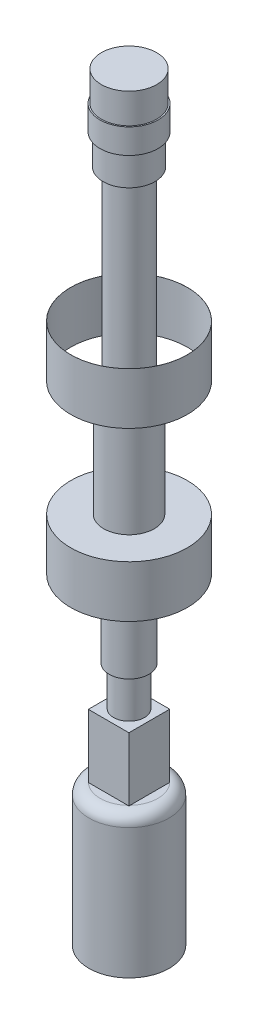
ISO-10303-21;
HEADER;
FILE_DESCRIPTION(('STEP AP214'),'2;1');
FILE_NAME('part.step','',(''),(''),'','','');
FILE_SCHEMA(('AUTOMOTIVE_DESIGN { 1 0 10303 214 1 1 1 1 }'));
ENDSEC;
DATA;
#1=APPLICATION_CONTEXT('core data for automotive mechanical design processes');
#2=APPLICATION_PROTOCOL_DEFINITION('international standard','automotive_design',2000,#1);
#3=PRODUCT_CONTEXT('',#1,'mechanical');
#4=PRODUCT('Part','Part','',(#3));
#5=PRODUCT_RELATED_PRODUCT_CATEGORY('part','',(#4));
#6=PRODUCT_DEFINITION_FORMATION('','',#4);
#7=PRODUCT_DEFINITION_CONTEXT('part definition',#1,'design');
#8=PRODUCT_DEFINITION('design','',#6,#7);
#9=PRODUCT_DEFINITION_SHAPE('','',#8);
#10=(LENGTH_UNIT() NAMED_UNIT(*) SI_UNIT(.MILLI.,.METRE.));
#11=(NAMED_UNIT(*) PLANE_ANGLE_UNIT() SI_UNIT($,.RADIAN.));
#12=(NAMED_UNIT(*) SI_UNIT($,.STERADIAN.) SOLID_ANGLE_UNIT());
#13=UNCERTAINTY_MEASURE_WITH_UNIT(LENGTH_MEASURE(1.E-05),#10,'distance_accuracy_value','');
#14=(GEOMETRIC_REPRESENTATION_CONTEXT(3) GLOBAL_UNCERTAINTY_ASSIGNED_CONTEXT((#13)) GLOBAL_UNIT_ASSIGNED_CONTEXT((#10,
#11,#12)) REPRESENTATION_CONTEXT('',''));
#15=CARTESIAN_POINT('',(0.,0.,0.));
#16=DIRECTION('',(0.,0.,1.));
#17=DIRECTION('',(1.,0.,0.));
#18=AXIS2_PLACEMENT_3D('',#15,#16,#17);
#19=CARTESIAN_POINT('',(36.9158813836408,487.4,-31.0812191882091));
#20=DIRECTION('',(0.,1.,0.));
#21=DIRECTION('',(0.,0.,1.));
#22=AXIS2_PLACEMENT_3D('',#19,#20,#21);
#23=PLANE('',#22);
#24=CARTESIAN_POINT('',(36.9158813836408,487.4,-31.0812191882091));
#25=DIRECTION('',(0.,1.,0.));
#26=DIRECTION('',(0.,0.,1.));
#27=AXIS2_PLACEMENT_3D('',#24,#25,#26);
#28=CIRCLE('',#27,51.55);
#29=CARTESIAN_POINT('',(36.9158813836408,487.4,-82.6312191882091));
#30=VERTEX_POINT('',#29);
#31=EDGE_CURVE('E11',#30,#30,#28,.T.);
#32=ORIENTED_EDGE('',*,*,#31,.T.);
#33=EDGE_LOOP('',(#32));
#34=FACE_BOUND('',#33,.T.);
#35=CARTESIAN_POINT('',(36.9158813836408,487.4,-31.0812191882091));
#36=DIRECTION('',(0.,1.,0.));
#37=DIRECTION('',(0.,0.,1.));
#38=AXIS2_PLACEMENT_3D('',#35,#36,#37);
#39=CIRCLE('',#38,51.51);
#40=CARTESIAN_POINT('',(36.9158813836408,487.4,-82.5912191882091));
#41=VERTEX_POINT('',#40);
#42=EDGE_CURVE('E56',#41,#41,#39,.T.);
#43=ORIENTED_EDGE('',*,*,#42,.F.);
#44=EDGE_LOOP('',(#43));
#45=FACE_BOUND('',#44,.T.);
#46=ADVANCED_FACE('F45',(#34,#45),#23,.T.);
#47=CARTESIAN_POINT('',(36.9158813836408,441.7,-31.0812191882091));
#48=DIRECTION('',(0.,1.,0.));
#49=DIRECTION('',(0.,0.,1.));
#50=AXIS2_PLACEMENT_3D('',#47,#48,#49);
#51=PLANE('',#50);
#52=CARTESIAN_POINT('',(36.9158813836408,441.7,-31.0812191882091));
#53=DIRECTION('',(0.,1.,0.));
#54=DIRECTION('',(0.,0.,1.));
#55=AXIS2_PLACEMENT_3D('',#52,#53,#54);
#56=CIRCLE('',#55,51.55);
#57=CARTESIAN_POINT('',(36.9158813836408,441.7,-82.6312191882091));
#58=VERTEX_POINT('',#57);
#59=EDGE_CURVE('E49',#58,#58,#56,.T.);
#60=ORIENTED_EDGE('',*,*,#59,.F.);
#61=EDGE_LOOP('',(#60));
#62=FACE_BOUND('',#61,.T.);
#63=CARTESIAN_POINT('',(36.9158813836408,441.7,-31.0812191882091));
#64=DIRECTION('',(0.,1.,0.));
#65=DIRECTION('',(0.,0.,1.));
#66=AXIS2_PLACEMENT_3D('',#63,#64,#65);
#67=CIRCLE('',#66,51.51);
#68=CARTESIAN_POINT('',(36.9158813836408,441.7,-82.5912191882091));
#69=VERTEX_POINT('',#68);
#70=EDGE_CURVE('E58',#69,#69,#67,.T.);
#71=ORIENTED_EDGE('',*,*,#70,.T.);
#72=EDGE_LOOP('',(#71));
#73=FACE_BOUND('',#72,.T.);
#74=ADVANCED_FACE('F68',(#62,#73),#51,.F.);
#75=CARTESIAN_POINT('',(36.9158813836408,487.4,-31.0812191882091));
#76=DIRECTION('',(0.,-1.,0.));
#77=DIRECTION('',(0.,0.,-1.));
#78=AXIS2_PLACEMENT_3D('',#75,#76,#77);
#79=CYLINDRICAL_SURFACE('',#78,51.55);
#80=CARTESIAN_POINT('',(36.9158813836408,487.4,-82.6312191882091));
#81=CARTESIAN_POINT('',(36.9158813836408,486.923958333333,-82.6312191882091));
#82=CARTESIAN_POINT('',(36.9158813836408,486.447916666667,-82.6312191882091));
#83=CARTESIAN_POINT('',(36.9158813836408,485.495833333333,-82.6312191882091));
#84=CARTESIAN_POINT('',(36.9158813836408,485.019791666667,-82.6312191882091));
#85=CARTESIAN_POINT('',(36.9158813836408,484.067708333333,-82.6312191882091));
#86=CARTESIAN_POINT('',(36.9158813836408,483.591666666667,-82.6312191882091));
#87=CARTESIAN_POINT('',(36.9158813836408,482.639583333333,-82.6312191882091));
#88=CARTESIAN_POINT('',(36.9158813836408,482.163541666667,-82.6312191882091));
#89=CARTESIAN_POINT('',(36.9158813836408,481.211458333333,-82.6312191882091));
#90=CARTESIAN_POINT('',(36.9158813836408,480.735416666667,-82.6312191882091));
#91=CARTESIAN_POINT('',(36.9158813836408,479.783333333333,-82.6312191882091));
#92=CARTESIAN_POINT('',(36.9158813836408,479.307291666667,-82.6312191882091));
#93=CARTESIAN_POINT('',(36.9158813836408,478.355208333333,-82.6312191882091));
#94=CARTESIAN_POINT('',(36.9158813836408,477.879166666667,-82.6312191882091));
#95=CARTESIAN_POINT('',(36.9158813836408,476.927083333333,-82.6312191882091));
#96=CARTESIAN_POINT('',(36.9158813836408,476.451041666667,-82.6312191882091));
#97=CARTESIAN_POINT('',(36.9158813836408,475.498958333333,-82.6312191882091));
#98=CARTESIAN_POINT('',(36.9158813836408,475.022916666667,-82.6312191882091));
#99=CARTESIAN_POINT('',(36.9158813836408,474.070833333333,-82.6312191882091));
#100=CARTESIAN_POINT('',(36.9158813836408,473.594791666667,-82.6312191882091));
#101=CARTESIAN_POINT('',(36.9158813836408,472.642708333333,-82.6312191882091));
#102=CARTESIAN_POINT('',(36.9158813836408,472.166666666667,-82.6312191882091));
#103=CARTESIAN_POINT('',(36.9158813836408,471.214583333333,-82.6312191882091));
#104=CARTESIAN_POINT('',(36.9158813836408,470.738541666667,-82.6312191882091));
#105=CARTESIAN_POINT('',(36.9158813836408,469.786458333333,-82.6312191882091));
#106=CARTESIAN_POINT('',(36.9158813836408,469.310416666667,-82.6312191882091));
#107=CARTESIAN_POINT('',(36.9158813836408,468.358333333333,-82.6312191882091));
#108=CARTESIAN_POINT('',(36.9158813836408,467.882291666667,-82.6312191882091));
#109=CARTESIAN_POINT('',(36.9158813836408,466.930208333333,-82.6312191882091));
#110=CARTESIAN_POINT('',(36.9158813836408,466.454166666667,-82.6312191882091));
#111=CARTESIAN_POINT('',(36.9158813836408,465.502083333333,-82.6312191882091));
#112=CARTESIAN_POINT('',(36.9158813836408,465.026041666667,-82.6312191882091));
#113=CARTESIAN_POINT('',(36.9158813836408,464.073958333333,-82.6312191882091));
#114=CARTESIAN_POINT('',(36.9158813836408,463.597916666667,-82.6312191882091));
#115=CARTESIAN_POINT('',(36.9158813836408,462.645833333333,-82.6312191882091));
#116=CARTESIAN_POINT('',(36.9158813836408,462.169791666667,-82.6312191882091));
#117=CARTESIAN_POINT('',(36.9158813836408,461.217708333333,-82.6312191882091));
#118=CARTESIAN_POINT('',(36.9158813836408,460.741666666667,-82.6312191882091));
#119=CARTESIAN_POINT('',(36.9158813836408,459.789583333333,-82.6312191882091));
#120=CARTESIAN_POINT('',(36.9158813836408,459.313541666667,-82.6312191882091));
#121=CARTESIAN_POINT('',(36.9158813836408,458.361458333333,-82.6312191882091));
#122=CARTESIAN_POINT('',(36.9158813836408,457.885416666667,-82.6312191882091));
#123=CARTESIAN_POINT('',(36.9158813836408,456.933333333333,-82.6312191882091));
#124=CARTESIAN_POINT('',(36.9158813836408,456.457291666667,-82.6312191882091));
#125=CARTESIAN_POINT('',(36.9158813836408,455.505208333333,-82.6312191882091));
#126=CARTESIAN_POINT('',(36.9158813836408,455.029166666667,-82.6312191882091));
#127=CARTESIAN_POINT('',(36.9158813836408,454.077083333333,-82.6312191882091));
#128=CARTESIAN_POINT('',(36.9158813836408,453.601041666667,-82.6312191882091));
#129=CARTESIAN_POINT('',(36.9158813836408,452.648958333333,-82.6312191882091));
#130=CARTESIAN_POINT('',(36.9158813836408,452.172916666667,-82.6312191882091));
#131=CARTESIAN_POINT('',(36.9158813836408,451.220833333333,-82.6312191882091));
#132=CARTESIAN_POINT('',(36.9158813836408,450.744791666667,-82.6312191882091));
#133=CARTESIAN_POINT('',(36.9158813836408,449.792708333333,-82.6312191882091));
#134=CARTESIAN_POINT('',(36.9158813836408,449.316666666667,-82.6312191882091));
#135=CARTESIAN_POINT('',(36.9158813836408,448.364583333333,-82.6312191882091));
#136=CARTESIAN_POINT('',(36.9158813836408,447.888541666667,-82.6312191882091));
#137=CARTESIAN_POINT('',(36.9158813836408,446.936458333333,-82.6312191882091));
#138=CARTESIAN_POINT('',(36.9158813836408,446.460416666667,-82.6312191882091));
#139=CARTESIAN_POINT('',(36.9158813836408,445.508333333333,-82.6312191882091));
#140=CARTESIAN_POINT('',(36.9158813836408,445.032291666667,-82.6312191882091));
#141=CARTESIAN_POINT('',(36.9158813836408,444.080208333333,-82.6312191882091));
#142=CARTESIAN_POINT('',(36.9158813836408,443.604166666667,-82.6312191882091));
#143=CARTESIAN_POINT('',(36.9158813836408,442.652083333333,-82.6312191882091));
#144=CARTESIAN_POINT('',(36.9158813836408,442.176041666667,-82.6312191882091));
#145=CARTESIAN_POINT('',(36.9158813836408,441.7,-82.6312191882091));
#146=B_SPLINE_CURVE_WITH_KNOTS('',3,(#80,#81,#82,#83,#84,#85,#86,#87,#88,#89,#90,#91,#92,#93,
#94,#95,#96,#97,#98,#99,#100,#101,#102,#103,#104,#105,#106,#107,#108,#109,#110,#111,#112,#113,
#114,#115,#116,#117,#118,#119,#120,#121,#122,#123,#124,#125,#126,#127,#128,#129,#130,#131,#132,
#133,#134,#135,#136,#137,#138,#139,#140,#141,#142,#143,#144,#145),.UNSPECIFIED.,.F.,.F.,(4,2,2,
2,2,2,2,2,2,2,2,2,2,2,2,2,2,2,2,2,2,2,2,2,2,2,2,2,2,2,2,2,4),(0.,1.42812499999995,
2.85624999999995,4.28437499999995,5.71249999999995,7.14062499999996,8.56874999999996,
9.99687499999996,11.425,12.853125,14.28125,15.709375,17.1375,18.565625,19.99375,21.421875,22.85,
24.278125,25.70625,27.134375,28.5625,29.990625,31.41875,32.846875,34.275,35.703125,37.13125,
38.559375,39.9875,41.415625,42.84375,44.271875,45.7),.UNSPECIFIED.);
#147=EDGE_CURVE('BSEAM47',#30,#58,#146,.T.);
#148=ORIENTED_EDGE('',*,*,#31,.F.);
#149=ORIENTED_EDGE('',*,*,#59,.T.);
#150=ORIENTED_EDGE('',*,*,#147,.T.);
#151=ORIENTED_EDGE('',*,*,#147,.F.);
#152=EDGE_LOOP('',(#148,#150,#149,#151));
#153=FACE_BOUND('',#152,.T.);
#154=ADVANCED_FACE('F47',(#153),#79,.T.);
#155=CARTESIAN_POINT('',(36.9158813836408,487.4,-31.0812191882091));
#156=DIRECTION('',(0.,-1.,0.));
#157=DIRECTION('',(0.,0.,-1.));
#158=AXIS2_PLACEMENT_3D('',#155,#156,#157);
#159=CYLINDRICAL_SURFACE('',#158,51.51);
#160=CARTESIAN_POINT('',(36.9158813836408,487.4,-82.5912191882091));
#161=CARTESIAN_POINT('',(36.9158813836408,486.923958333333,-82.5912191882091));
#162=CARTESIAN_POINT('',(36.9158813836408,486.447916666667,-82.5912191882091));
#163=CARTESIAN_POINT('',(36.9158813836408,485.495833333333,-82.5912191882091));
#164=CARTESIAN_POINT('',(36.9158813836408,485.019791666667,-82.5912191882091));
#165=CARTESIAN_POINT('',(36.9158813836408,484.067708333333,-82.5912191882091));
#166=CARTESIAN_POINT('',(36.9158813836408,483.591666666667,-82.5912191882091));
#167=CARTESIAN_POINT('',(36.9158813836408,482.639583333333,-82.5912191882091));
#168=CARTESIAN_POINT('',(36.9158813836408,482.163541666667,-82.5912191882091));
#169=CARTESIAN_POINT('',(36.9158813836408,481.211458333333,-82.5912191882091));
#170=CARTESIAN_POINT('',(36.9158813836408,480.735416666667,-82.5912191882091));
#171=CARTESIAN_POINT('',(36.9158813836408,479.783333333333,-82.5912191882091));
#172=CARTESIAN_POINT('',(36.9158813836408,479.307291666667,-82.5912191882091));
#173=CARTESIAN_POINT('',(36.9158813836408,478.355208333333,-82.5912191882091));
#174=CARTESIAN_POINT('',(36.9158813836408,477.879166666667,-82.5912191882091));
#175=CARTESIAN_POINT('',(36.9158813836408,476.927083333333,-82.5912191882091));
#176=CARTESIAN_POINT('',(36.9158813836408,476.451041666667,-82.5912191882091));
#177=CARTESIAN_POINT('',(36.9158813836408,475.498958333333,-82.5912191882091));
#178=CARTESIAN_POINT('',(36.9158813836408,475.022916666667,-82.5912191882091));
#179=CARTESIAN_POINT('',(36.9158813836408,474.070833333333,-82.5912191882091));
#180=CARTESIAN_POINT('',(36.9158813836408,473.594791666667,-82.5912191882091));
#181=CARTESIAN_POINT('',(36.9158813836408,472.642708333333,-82.5912191882091));
#182=CARTESIAN_POINT('',(36.9158813836408,472.166666666667,-82.5912191882091));
#183=CARTESIAN_POINT('',(36.9158813836408,471.214583333333,-82.5912191882091));
#184=CARTESIAN_POINT('',(36.9158813836408,470.738541666667,-82.5912191882091));
#185=CARTESIAN_POINT('',(36.9158813836408,469.786458333333,-82.5912191882091));
#186=CARTESIAN_POINT('',(36.9158813836408,469.310416666667,-82.5912191882091));
#187=CARTESIAN_POINT('',(36.9158813836408,468.358333333333,-82.5912191882091));
#188=CARTESIAN_POINT('',(36.9158813836408,467.882291666667,-82.5912191882091));
#189=CARTESIAN_POINT('',(36.9158813836408,466.930208333333,-82.5912191882091));
#190=CARTESIAN_POINT('',(36.9158813836408,466.454166666667,-82.5912191882091));
#191=CARTESIAN_POINT('',(36.9158813836408,465.502083333333,-82.5912191882091));
#192=CARTESIAN_POINT('',(36.9158813836408,465.026041666667,-82.5912191882091));
#193=CARTESIAN_POINT('',(36.9158813836408,464.073958333333,-82.5912191882091));
#194=CARTESIAN_POINT('',(36.9158813836408,463.597916666667,-82.5912191882091));
#195=CARTESIAN_POINT('',(36.9158813836408,462.645833333333,-82.5912191882091));
#196=CARTESIAN_POINT('',(36.9158813836408,462.169791666667,-82.5912191882091));
#197=CARTESIAN_POINT('',(36.9158813836408,461.217708333333,-82.5912191882091));
#198=CARTESIAN_POINT('',(36.9158813836408,460.741666666667,-82.5912191882091));
#199=CARTESIAN_POINT('',(36.9158813836408,459.789583333333,-82.5912191882091));
#200=CARTESIAN_POINT('',(36.9158813836408,459.313541666667,-82.5912191882091));
#201=CARTESIAN_POINT('',(36.9158813836408,458.361458333333,-82.5912191882091));
#202=CARTESIAN_POINT('',(36.9158813836408,457.885416666667,-82.5912191882091));
#203=CARTESIAN_POINT('',(36.9158813836408,456.933333333333,-82.5912191882091));
#204=CARTESIAN_POINT('',(36.9158813836408,456.457291666667,-82.5912191882091));
#205=CARTESIAN_POINT('',(36.9158813836408,455.505208333333,-82.5912191882091));
#206=CARTESIAN_POINT('',(36.9158813836408,455.029166666667,-82.5912191882091));
#207=CARTESIAN_POINT('',(36.9158813836408,454.077083333333,-82.5912191882091));
#208=CARTESIAN_POINT('',(36.9158813836408,453.601041666667,-82.5912191882091));
#209=CARTESIAN_POINT('',(36.9158813836408,452.648958333333,-82.5912191882091));
#210=CARTESIAN_POINT('',(36.9158813836408,452.172916666667,-82.5912191882091));
#211=CARTESIAN_POINT('',(36.9158813836408,451.220833333333,-82.5912191882091));
#212=CARTESIAN_POINT('',(36.9158813836408,450.744791666667,-82.5912191882091));
#213=CARTESIAN_POINT('',(36.9158813836408,449.792708333333,-82.5912191882091));
#214=CARTESIAN_POINT('',(36.9158813836408,449.316666666667,-82.5912191882091));
#215=CARTESIAN_POINT('',(36.9158813836408,448.364583333333,-82.5912191882091));
#216=CARTESIAN_POINT('',(36.9158813836408,447.888541666667,-82.5912191882091));
#217=CARTESIAN_POINT('',(36.9158813836408,446.936458333333,-82.5912191882091));
#218=CARTESIAN_POINT('',(36.9158813836408,446.460416666667,-82.5912191882091));
#219=CARTESIAN_POINT('',(36.9158813836408,445.508333333333,-82.5912191882091));
#220=CARTESIAN_POINT('',(36.9158813836408,445.032291666667,-82.5912191882091));
#221=CARTESIAN_POINT('',(36.9158813836408,444.080208333333,-82.5912191882091));
#222=CARTESIAN_POINT('',(36.9158813836408,443.604166666667,-82.5912191882091));
#223=CARTESIAN_POINT('',(36.9158813836408,442.652083333333,-82.5912191882091));
#224=CARTESIAN_POINT('',(36.9158813836408,442.176041666667,-82.5912191882091));
#225=CARTESIAN_POINT('',(36.9158813836408,441.7,-82.5912191882091));
#226=B_SPLINE_CURVE_WITH_KNOTS('',3,(#160,#161,#162,#163,#164,#165,#166,#167,#168,#169,#170,
#171,#172,#173,#174,#175,#176,#177,#178,#179,#180,#181,#182,#183,#184,#185,#186,#187,#188,#189,
#190,#191,#192,#193,#194,#195,#196,#197,#198,#199,#200,#201,#202,#203,#204,#205,#206,#207,#208,
#209,#210,#211,#212,#213,#214,#215,#216,#217,#218,#219,#220,#221,#222,#223,#224,#225),
.UNSPECIFIED.,.F.,.F.,(4,2,2,2,2,2,2,2,2,2,2,2,2,2,2,2,2,2,2,2,2,2,2,2,2,2,2,2,2,2,2,2,4),(0.,
1.428125,2.85625,4.28437500000001,5.71250000000001,7.14062500000001,8.56875000000001,
9.99687500000002,11.425,12.853125,14.28125,15.709375,17.1375,18.565625,19.99375,21.421875,22.85,
24.278125,25.70625,27.134375,28.5625,29.990625,31.4187500000001,32.8468750000001,
34.2750000000001,35.7031250000001,37.1312500000001,38.5593750000001,39.9875000000001,
41.4156250000001,42.84375,44.271875,45.7),.UNSPECIFIED.);
#227=EDGE_CURVE('BSEAM64',#41,#69,#226,.T.);
#228=ORIENTED_EDGE('',*,*,#42,.T.);
#229=ORIENTED_EDGE('',*,*,#70,.F.);
#230=ORIENTED_EDGE('',*,*,#227,.T.);
#231=ORIENTED_EDGE('',*,*,#227,.F.);
#232=EDGE_LOOP('',(#228,#230,#229,#231));
#233=FACE_BOUND('',#232,.T.);
#234=ADVANCED_FACE('F64',(#233),#159,.F.);
#235=CLOSED_SHELL('',(#46,#74,#154,#234));
#236=MANIFOLD_SOLID_BREP('B2',#235);
#237=CARTESIAN_POINT('',(36.9158813836408,135.,-31.0812191882091));
#238=DIRECTION('',(0.,1.,0.));
#239=DIRECTION('',(0.,0.,1.));
#240=AXIS2_PLACEMENT_3D('',#237,#238,#239);
#241=PLANE('',#240);
#242=CARTESIAN_POINT('',(36.9158813836408,135.,-31.0812191882091));
#243=DIRECTION('',(0.,1.,0.));
#244=DIRECTION('',(0.,0.,1.));
#245=AXIS2_PLACEMENT_3D('',#242,#243,#244);
#246=CIRCLE('',#245,25.4211124709785);
#247=CARTESIAN_POINT('',(19.4888926142153,135.,-12.5735715339971));
#248=VERTEX_POINT('',#247);
#249=CARTESIAN_POINT('',(54.3428701530662,135.,-12.5735715339971));
#250=VERTEX_POINT('',#249);
#251=EDGE_CURVE('E189',#248,#250,#246,.T.);
#252=ORIENTED_EDGE('',*,*,#251,.T.);
#253=DIRECTION('',(1.,0.,0.));
#254=VECTOR('',#253,1.);
#255=CARTESIAN_POINT('',(19.4888926142153,135.,-12.5735715339971));
#256=LINE('',#255,#254);
#257=EDGE_CURVE('E129',#248,#250,#256,.T.);
#258=ORIENTED_EDGE('',*,*,#257,.F.);
#259=EDGE_LOOP('',(#252,#258));
#260=FACE_BOUND('',#259,.T.);
#261=ADVANCED_FACE('F107',(#260),#241,.T.);
#262=CARTESIAN_POINT('',(55.3117195204943,135.,-48.626192784793));
#263=VERTEX_POINT('',#262);
#264=EDGE_CURVE('E232',#263,#248,#246,.T.);
#265=ORIENTED_EDGE('',*,*,#264,.T.);
#266=DIRECTION('',(0.,0.,1.));
#267=VECTOR('',#266,1.);
#268=CARTESIAN_POINT('',(19.4888926142153,135.,-12.5735715339971));
#269=LINE('',#268,#267);
#270=CARTESIAN_POINT('',(19.4888926142153,135.,-48.626192784793));
#271=VERTEX_POINT('',#270);
#272=EDGE_CURVE('E122',#271,#248,#269,.T.);
#273=ORIENTED_EDGE('',*,*,#272,.F.);
#274=DIRECTION('',(-1.,0.,0.));
#275=VECTOR('',#274,1.);
#276=CARTESIAN_POINT('',(19.4888926142153,135.,-48.626192784793));
#277=LINE('',#276,#275);
#278=EDGE_CURVE('E174',#263,#271,#277,.T.);
#279=ORIENTED_EDGE('',*,*,#278,.F.);
#280=EDGE_LOOP('',(#265,#273,#279));
#281=FACE_BOUND('',#280,.T.);
#282=ADVANCED_FACE('F234',(#281),#241,.T.);
#283=CARTESIAN_POINT('',(55.3117195204943,135.,-13.5362455916253));
#284=VERTEX_POINT('',#283);
#285=EDGE_CURVE('E194',#284,#263,#246,.T.);
#286=ORIENTED_EDGE('',*,*,#285,.T.);
#287=DIRECTION('',(0.,0.,-1.));
#288=VECTOR('',#287,1.);
#289=CARTESIAN_POINT('',(55.3117195204943,135.,-12.5735715339971));
#290=LINE('',#289,#288);
#291=EDGE_CURVE('E216',#284,#263,#290,.T.);
#292=ORIENTED_EDGE('',*,*,#291,.F.);
#293=EDGE_LOOP('',(#286,#292));
#294=FACE_BOUND('',#293,.T.);
#295=ADVANCED_FACE('F231',(#294),#241,.T.);
#296=CARTESIAN_POINT('',(36.9158813836408,10.,-31.0812191882091));
#297=DIRECTION('',(0.,-1.,0.));
#298=DIRECTION('',(0.,0.,-1.));
#299=AXIS2_PLACEMENT_3D('',#296,#297,#298);
#300=CYLINDRICAL_SURFACE('',#299,17.732160556241);
#301=CARTESIAN_POINT('',(36.9158813836408,10.,-31.0812191882091));
#302=DIRECTION('',(0.,1.,0.));
#303=DIRECTION('',(0.,0.,1.));
#304=AXIS2_PLACEMENT_3D('',#301,#302,#303);
#305=CIRCLE('',#304,17.732160556241);
#306=CARTESIAN_POINT('',(36.9158813836408,10.,-13.3490586319682));
#307=VERTEX_POINT('',#306);
#308=EDGE_CURVE('E186',#307,#307,#305,.T.);
#309=ORIENTED_EDGE('',*,*,#308,.F.);
#310=EDGE_LOOP('',(#309));
#311=FACE_BOUND('',#310,.T.);
#312=CARTESIAN_POINT('',(36.9158813836408,0.,-31.0812191882091));
#313=DIRECTION('',(0.,1.,0.));
#314=DIRECTION('',(0.,0.,1.));
#315=AXIS2_PLACEMENT_3D('',#312,#313,#314);
#316=CIRCLE('',#315,17.732160556241);
#317=CARTESIAN_POINT('',(36.9158813836408,0.,-13.3490586319682));
#318=VERTEX_POINT('',#317);
#319=EDGE_CURVE('E180',#318,#318,#316,.T.);
#320=ORIENTED_EDGE('',*,*,#319,.T.);
#321=EDGE_LOOP('',(#320));
#322=FACE_BOUND('',#321,.T.);
#323=ADVANCED_FACE('F242',(#311,#322),#300,.T.);
#324=CARTESIAN_POINT('',(36.9158813836408,0.,-31.0812191882091));
#325=DIRECTION('',(0.,1.,0.));
#326=DIRECTION('',(0.,0.,1.));
#327=AXIS2_PLACEMENT_3D('',#324,#325,#326);
#328=PLANE('',#327);
#329=ORIENTED_EDGE('',*,*,#319,.F.);
#330=EDGE_LOOP('',(#329));
#331=FACE_BOUND('',#330,.T.);
#332=ADVANCED_FACE('F246',(#331),#328,.F.);
#333=CARTESIAN_POINT('',(36.9158813836408,105.,-31.0812191882091));
#334=DIRECTION('',(0.,-1.,0.));
#335=DIRECTION('',(0.,0.,-1.));
#336=AXIS2_PLACEMENT_3D('',#333,#334,#335);
#337=CYLINDRICAL_SURFACE('',#336,35.4211124709785);
#338=CARTESIAN_POINT('',(36.9158813836408,125.,-31.0812191882091));
#339=DIRECTION('',(0.,1.,0.));
#340=DIRECTION('',(0.,0.,1.));
#341=AXIS2_PLACEMENT_3D('',#338,#339,#340);
#342=CIRCLE('',#341,35.4211124709785);
#343=CARTESIAN_POINT('',(36.9158813836408,125.,4.33989328276939));
#344=VERTEX_POINT('',#343);
#345=EDGE_CURVE('E115',#344,#344,#342,.F.);
#346=ORIENTED_EDGE('',*,*,#345,.T.);
#347=EDGE_LOOP('',(#346));
#348=FACE_BOUND('',#347,.T.);
#349=CARTESIAN_POINT('',(36.9158813836408,10.,-31.0812191882091));
#350=DIRECTION('',(0.,1.,0.));
#351=DIRECTION('',(0.,0.,1.));
#352=AXIS2_PLACEMENT_3D('',#349,#350,#351);
#353=CIRCLE('',#352,35.4211124709785);
#354=CARTESIAN_POINT('',(36.9158813836408,10.,4.33989328276939));
#355=VERTEX_POINT('',#354);
#356=EDGE_CURVE('E177',#355,#355,#353,.T.);
#357=ORIENTED_EDGE('',*,*,#356,.T.);
#358=EDGE_LOOP('',(#357));
#359=FACE_BOUND('',#358,.T.);
#360=ADVANCED_FACE('F198',(#348,#359),#337,.T.);
#361=CARTESIAN_POINT('',(36.9158813836408,10.,-31.0812191882091));
#362=DIRECTION('',(0.,1.,0.));
#363=DIRECTION('',(0.,0.,1.));
#364=AXIS2_PLACEMENT_3D('',#361,#362,#363);
#365=PLANE('',#364);
#366=ORIENTED_EDGE('',*,*,#308,.T.);
#367=EDGE_LOOP('',(#366));
#368=FACE_BOUND('',#367,.T.);
#369=ORIENTED_EDGE('',*,*,#356,.F.);
#370=EDGE_LOOP('',(#369));
#371=FACE_BOUND('',#370,.T.);
#372=ADVANCED_FACE('F203',(#368,#371),#365,.F.);
#373=CARTESIAN_POINT('',(36.9158813836408,125.,-31.0812191882091));
#374=DIRECTION('',(0.,1.,0.));
#375=DIRECTION('',(0.,0.,1.));
#376=AXIS2_PLACEMENT_3D('',#373,#374,#375);
#377=TOROIDAL_SURFACE('',#376,25.4211124709785,10.);
#378=ORIENTED_EDGE('',*,*,#345,.F.);
#379=EDGE_LOOP('',(#378));
#380=FACE_BOUND('',#379,.T.);
#381=EDGE_CURVE('E192',#250,#284,#246,.T.);
#382=ORIENTED_EDGE('',*,*,#381,.F.);
#383=ORIENTED_EDGE('',*,*,#251,.F.);
#384=ORIENTED_EDGE('',*,*,#264,.F.);
#385=ORIENTED_EDGE('',*,*,#285,.F.);
#386=EDGE_LOOP('',(#382,#383,#384,#385));
#387=FACE_BOUND('',#386,.T.);
#388=ADVANCED_FACE('F109',(#380,#387),#377,.T.);
#389=CARTESIAN_POINT('',(19.4888926142153,191.,-12.5735715339971));
#390=DIRECTION('',(1.,0.,0.));
#391=DIRECTION('',(0.,0.,-1.));
#392=AXIS2_PLACEMENT_3D('',#389,#390,#391);
#393=PLANE('',#392);
#394=ORIENTED_EDGE('',*,*,#272,.T.);
#395=DIRECTION('',(0.,-1.,0.));
#396=VECTOR('',#395,1.);
#397=CARTESIAN_POINT('',(19.4888926142153,191.,-12.5735715339971));
#398=LINE('',#397,#396);
#399=CARTESIAN_POINT('',(19.4888926142153,191.,-12.5735715339971));
#400=VERTEX_POINT('',#399);
#401=EDGE_CURVE('E159',#400,#248,#398,.T.);
#402=ORIENTED_EDGE('',*,*,#401,.F.);
#403=DIRECTION('',(0.,0.,1.));
#404=VECTOR('',#403,1.);
#405=CARTESIAN_POINT('',(19.4888926142153,191.,-12.5735715339971));
#406=LINE('',#405,#404);
#407=CARTESIAN_POINT('',(19.4888926142153,191.,-48.626192784793));
#408=VERTEX_POINT('',#407);
#409=EDGE_CURVE('E165',#408,#400,#406,.T.);
#410=ORIENTED_EDGE('',*,*,#409,.F.);
#411=DIRECTION('',(0.,-1.,0.));
#412=VECTOR('',#411,1.);
#413=CARTESIAN_POINT('',(19.4888926142153,191.,-48.626192784793));
#414=LINE('',#413,#412);
#415=EDGE_CURVE('E223',#408,#271,#414,.T.);
#416=ORIENTED_EDGE('',*,*,#415,.T.);
#417=EDGE_LOOP('',(#394,#402,#410,#416));
#418=FACE_BOUND('',#417,.T.);
#419=ADVANCED_FACE('F176',(#418),#393,.F.);
#420=CARTESIAN_POINT('',(19.4888926142153,191.,-12.5735715339971));
#421=DIRECTION('',(0.,0.,-1.));
#422=DIRECTION('',(-1.,0.,0.));
#423=AXIS2_PLACEMENT_3D('',#420,#421,#422);
#424=PLANE('',#423);
#425=ORIENTED_EDGE('',*,*,#257,.T.);
#426=CARTESIAN_POINT('',(55.3117195204943,135.,-12.5735715339971));
#427=VERTEX_POINT('',#426);
#428=EDGE_CURVE('E212',#250,#427,#256,.T.);
#429=ORIENTED_EDGE('',*,*,#428,.T.);
#430=DIRECTION('',(0.,-1.,0.));
#431=VECTOR('',#430,1.);
#432=CARTESIAN_POINT('',(55.3117195204943,191.,-12.5735715339971));
#433=LINE('',#432,#431);
#434=CARTESIAN_POINT('',(55.3117195204943,191.,-12.5735715339971));
#435=VERTEX_POINT('',#434);
#436=EDGE_CURVE('E161',#435,#427,#433,.T.);
#437=ORIENTED_EDGE('',*,*,#436,.F.);
#438=DIRECTION('',(1.,0.,0.));
#439=VECTOR('',#438,1.);
#440=CARTESIAN_POINT('',(19.4888926142153,191.,-12.5735715339971));
#441=LINE('',#440,#439);
#442=EDGE_CURVE('E155',#400,#435,#441,.T.);
#443=ORIENTED_EDGE('',*,*,#442,.F.);
#444=ORIENTED_EDGE('',*,*,#401,.T.);
#445=EDGE_LOOP('',(#425,#429,#437,#443,#444));
#446=FACE_BOUND('',#445,.T.);
#447=ADVANCED_FACE('F157',(#446),#424,.F.);
#448=CARTESIAN_POINT('',(55.3117195204943,191.,-12.5735715339971));
#449=DIRECTION('',(-1.,0.,0.));
#450=DIRECTION('',(0.,0.,1.));
#451=AXIS2_PLACEMENT_3D('',#448,#449,#450);
#452=PLANE('',#451);
#453=EDGE_CURVE('E214',#427,#284,#290,.T.);
#454=ORIENTED_EDGE('',*,*,#453,.T.);
#455=ORIENTED_EDGE('',*,*,#291,.T.);
#456=DIRECTION('',(0.,-1.,0.));
#457=VECTOR('',#456,1.);
#458=CARTESIAN_POINT('',(55.3117195204943,191.,-48.626192784793));
#459=LINE('',#458,#457);
#460=CARTESIAN_POINT('',(55.3117195204943,191.,-48.626192784793));
#461=VERTEX_POINT('',#460);
#462=EDGE_CURVE('E182',#461,#263,#459,.T.);
#463=ORIENTED_EDGE('',*,*,#462,.F.);
#464=DIRECTION('',(0.,0.,-1.));
#465=VECTOR('',#464,1.);
#466=CARTESIAN_POINT('',(55.3117195204943,191.,-12.5735715339971));
#467=LINE('',#466,#465);
#468=EDGE_CURVE('E164',#435,#461,#467,.T.);
#469=ORIENTED_EDGE('',*,*,#468,.F.);
#470=ORIENTED_EDGE('',*,*,#436,.T.);
#471=EDGE_LOOP('',(#454,#455,#463,#469,#470));
#472=FACE_BOUND('',#471,.T.);
#473=ADVANCED_FACE('F229',(#472),#452,.F.);
#474=CARTESIAN_POINT('',(19.4888926142153,191.,-48.626192784793));
#475=DIRECTION('',(0.,0.,1.));
#476=DIRECTION('',(1.,0.,0.));
#477=AXIS2_PLACEMENT_3D('',#474,#475,#476);
#478=PLANE('',#477);
#479=ORIENTED_EDGE('',*,*,#278,.T.);
#480=ORIENTED_EDGE('',*,*,#415,.F.);
#481=DIRECTION('',(-1.,0.,0.));
#482=VECTOR('',#481,1.);
#483=CARTESIAN_POINT('',(19.4888926142153,191.,-48.626192784793));
#484=LINE('',#483,#482);
#485=EDGE_CURVE('E170',#461,#408,#484,.T.);
#486=ORIENTED_EDGE('',*,*,#485,.F.);
#487=ORIENTED_EDGE('',*,*,#462,.T.);
#488=EDGE_LOOP('',(#479,#480,#486,#487));
#489=FACE_BOUND('',#488,.T.);
#490=ADVANCED_FACE('F227',(#489),#478,.F.);
#491=CARTESIAN_POINT('',(0.,191.,0.));
#492=DIRECTION('',(0.,-1.,0.));
#493=DIRECTION('',(0.,0.,-1.));
#494=AXIS2_PLACEMENT_3D('',#491,#492,#493);
#495=PLANE('',#494);
#496=CARTESIAN_POINT('',(36.9158813836408,191.,-31.0812191882091));
#497=DIRECTION('',(0.,-1.,0.));
#498=DIRECTION('',(0.,0.,-1.));
#499=AXIS2_PLACEMENT_3D('',#496,#497,#498);
#500=CIRCLE('',#499,13.6624261133202);
#501=CARTESIAN_POINT('',(36.9158813836408,191.,-44.7436453015293));
#502=VERTEX_POINT('',#501);
#503=EDGE_CURVE('E43',#502,#502,#500,.F.);
#504=ORIENTED_EDGE('',*,*,#503,.F.);
#505=EDGE_LOOP('',(#504));
#506=FACE_BOUND('',#505,.T.);
#507=ORIENTED_EDGE('',*,*,#409,.T.);
#508=ORIENTED_EDGE('',*,*,#442,.T.);
#509=ORIENTED_EDGE('',*,*,#468,.T.);
#510=ORIENTED_EDGE('',*,*,#485,.T.);
#511=EDGE_LOOP('',(#507,#508,#509,#510));
#512=FACE_BOUND('',#511,.T.);
#513=ADVANCED_FACE('F168',(#506,#512),#495,.F.);
#514=CARTESIAN_POINT('',(0.,135.,0.));
#515=DIRECTION('',(0.,-1.,0.));
#516=DIRECTION('',(0.,0.,-1.));
#517=AXIS2_PLACEMENT_3D('',#514,#515,#516);
#518=PLANE('',#517);
#519=ORIENTED_EDGE('',*,*,#381,.T.);
#520=ORIENTED_EDGE('',*,*,#453,.F.);
#521=ORIENTED_EDGE('',*,*,#428,.F.);
#522=EDGE_LOOP('',(#519,#520,#521));
#523=FACE_BOUND('',#522,.T.);
#524=ADVANCED_FACE('F213',(#523),#518,.T.);
#525=CARTESIAN_POINT('',(36.9158813836408,226.,-31.0812191882091));
#526=DIRECTION('',(0.,-1.,0.));
#527=DIRECTION('',(0.,0.,-1.));
#528=AXIS2_PLACEMENT_3D('',#525,#526,#527);
#529=CYLINDRICAL_SURFACE('',#528,13.6624261133202);
#530=CARTESIAN_POINT('',(36.9158813836408,226.,-31.0812191882091));
#531=DIRECTION('',(0.,1.,0.));
#532=DIRECTION('',(0.,0.,1.));
#533=AXIS2_PLACEMENT_3D('',#530,#531,#532);
#534=CIRCLE('',#533,13.6624261133202);
#535=CARTESIAN_POINT('',(36.9158813836408,226.,-17.418793074889));
#536=VERTEX_POINT('',#535);
#537=EDGE_CURVE('E582',#536,#536,#534,.T.);
#538=ORIENTED_EDGE('',*,*,#537,.F.);
#539=EDGE_LOOP('',(#538));
#540=FACE_BOUND('',#539,.T.);
#541=ORIENTED_EDGE('',*,*,#503,.T.);
#542=EDGE_LOOP('',(#541));
#543=FACE_BOUND('',#542,.T.);
#544=ADVANCED_FACE('F307',(#540,#543),#529,.T.);
#545=CARTESIAN_POINT('',(36.9158813836408,274.,-31.0812191882091));
#546=DIRECTION('',(0.,-1.,0.));
#547=DIRECTION('',(0.,0.,-1.));
#548=AXIS2_PLACEMENT_3D('',#545,#546,#547);
#549=CYLINDRICAL_SURFACE('',#548,17.5449735965839);
#550=CARTESIAN_POINT('',(36.9158813836408,274.,-31.0812191882091));
#551=DIRECTION('',(0.,1.,0.));
#552=DIRECTION('',(0.,0.,1.));
#553=AXIS2_PLACEMENT_3D('',#550,#551,#552);
#554=CIRCLE('',#553,17.5449735965839);
#555=CARTESIAN_POINT('',(36.9158813836408,274.,-13.5362455916253));
#556=VERTEX_POINT('',#555);
#557=EDGE_CURVE('E579',#556,#556,#554,.T.);
#558=ORIENTED_EDGE('',*,*,#557,.F.);
#559=EDGE_LOOP('',(#558));
#560=FACE_BOUND('',#559,.T.);
#561=CARTESIAN_POINT('',(36.9158813836408,226.,-31.0812191882091));
#562=DIRECTION('',(0.,1.,0.));
#563=DIRECTION('',(0.,0.,1.));
#564=AXIS2_PLACEMENT_3D('',#561,#562,#563);
#565=CIRCLE('',#564,17.5449735965839);
#566=CARTESIAN_POINT('',(36.9158813836408,226.,-13.5362455916253));
#567=VERTEX_POINT('',#566);
#568=EDGE_CURVE('E576',#567,#567,#565,.T.);
#569=ORIENTED_EDGE('',*,*,#568,.T.);
#570=EDGE_LOOP('',(#569));
#571=FACE_BOUND('',#570,.T.);
#572=ADVANCED_FACE('F313',(#560,#571),#549,.T.);
#573=CARTESIAN_POINT('',(36.9158813836408,226.,-31.0812191882091));
#574=DIRECTION('',(0.,1.,0.));
#575=DIRECTION('',(0.,0.,1.));
#576=AXIS2_PLACEMENT_3D('',#573,#574,#575);
#577=PLANE('',#576);
#578=ORIENTED_EDGE('',*,*,#537,.T.);
#579=EDGE_LOOP('',(#578));
#580=FACE_BOUND('',#579,.T.);
#581=ORIENTED_EDGE('',*,*,#568,.F.);
#582=EDGE_LOOP('',(#581));
#583=FACE_BOUND('',#582,.T.);
#584=ADVANCED_FACE('F321',(#580,#583),#577,.F.);
#585=CARTESIAN_POINT('',(36.9158813836408,294.,-31.0812191882091));
#586=DIRECTION('',(0.,-1.,0.));
#587=DIRECTION('',(0.,0.,-1.));
#588=AXIS2_PLACEMENT_3D('',#585,#586,#587);
#589=CYLINDRICAL_SURFACE('',#588,20.);
#590=CARTESIAN_POINT('',(36.9158813836408,294.,-31.0812191882091));
#591=DIRECTION('',(0.,1.,0.));
#592=DIRECTION('',(0.,0.,1.));
#593=AXIS2_PLACEMENT_3D('',#590,#591,#592);
#594=CIRCLE('',#593,20.);
#595=CARTESIAN_POINT('',(36.9158813836408,294.,-11.0812191882091));
#596=VERTEX_POINT('',#595);
#597=EDGE_CURVE('E573',#596,#596,#594,.T.);
#598=ORIENTED_EDGE('',*,*,#597,.F.);
#599=EDGE_LOOP('',(#598));
#600=FACE_BOUND('',#599,.T.);
#601=CARTESIAN_POINT('',(36.9158813836408,274.,-31.0812191882091));
#602=DIRECTION('',(0.,1.,0.));
#603=DIRECTION('',(0.,0.,1.));
#604=AXIS2_PLACEMENT_3D('',#601,#602,#603);
#605=CIRCLE('',#604,20.);
#606=CARTESIAN_POINT('',(36.9158813836408,274.,-11.0812191882091));
#607=VERTEX_POINT('',#606);
#608=EDGE_CURVE('E570',#607,#607,#605,.T.);
#609=ORIENTED_EDGE('',*,*,#608,.T.);
#610=EDGE_LOOP('',(#609));
#611=FACE_BOUND('',#610,.T.);
#612=ADVANCED_FACE('F329',(#600,#611),#589,.T.);
#613=CARTESIAN_POINT('',(36.9158813836408,274.,-31.0812191882091));
#614=DIRECTION('',(0.,1.,0.));
#615=DIRECTION('',(0.,0.,1.));
#616=AXIS2_PLACEMENT_3D('',#613,#614,#615);
#617=PLANE('',#616);
#618=ORIENTED_EDGE('',*,*,#557,.T.);
#619=EDGE_LOOP('',(#618));
#620=FACE_BOUND('',#619,.T.);
#621=ORIENTED_EDGE('',*,*,#608,.F.);
#622=EDGE_LOOP('',(#621));
#623=FACE_BOUND('',#622,.T.);
#624=ADVANCED_FACE('F337',(#620,#623),#617,.F.);
#625=CARTESIAN_POINT('',(36.9158813836408,339.7,-31.0812191882091));
#626=DIRECTION('',(0.,-1.,0.));
#627=DIRECTION('',(0.,0.,-1.));
#628=AXIS2_PLACEMENT_3D('',#625,#626,#627);
#629=CYLINDRICAL_SURFACE('',#628,51.5);
#630=CARTESIAN_POINT('',(36.9158813836408,339.7,-31.0812191882091));
#631=DIRECTION('',(0.,1.,0.));
#632=DIRECTION('',(0.,0.,1.));
#633=AXIS2_PLACEMENT_3D('',#630,#631,#632);
#634=CIRCLE('',#633,51.5);
#635=CARTESIAN_POINT('',(36.9158813836408,339.7,-82.5812191882091));
#636=VERTEX_POINT('',#635);
#637=EDGE_CURVE('E567',#636,#636,#634,.T.);
#638=CARTESIAN_POINT('',(36.9158813836408,294.,-31.0812191882091));
#639=DIRECTION('',(0.,1.,0.));
#640=DIRECTION('',(0.,0.,1.));
#641=AXIS2_PLACEMENT_3D('',#638,#639,#640);
#642=CIRCLE('',#641,51.5);
#643=CARTESIAN_POINT('',(36.9158813836408,294.,-82.5812191882091));
#644=VERTEX_POINT('',#643);
#645=EDGE_CURVE('E564',#644,#644,#642,.T.);
#646=CARTESIAN_POINT('',(36.9158813836408,339.7,-82.5812191882091));
#647=CARTESIAN_POINT('',(36.9158813836408,339.223958333333,-82.5812191882091));
#648=CARTESIAN_POINT('',(36.9158813836408,338.747916666667,-82.5812191882091));
#649=CARTESIAN_POINT('',(36.9158813836408,337.795833333333,-82.5812191882091));
#650=CARTESIAN_POINT('',(36.9158813836408,337.319791666667,-82.5812191882091));
#651=CARTESIAN_POINT('',(36.9158813836408,336.367708333333,-82.5812191882091));
#652=CARTESIAN_POINT('',(36.9158813836408,335.891666666667,-82.5812191882091));
#653=CARTESIAN_POINT('',(36.9158813836408,334.939583333333,-82.5812191882091));
#654=CARTESIAN_POINT('',(36.9158813836408,334.463541666667,-82.5812191882091));
#655=CARTESIAN_POINT('',(36.9158813836408,333.511458333333,-82.5812191882091));
#656=CARTESIAN_POINT('',(36.9158813836408,333.035416666667,-82.5812191882091));
#657=CARTESIAN_POINT('',(36.9158813836408,332.083333333333,-82.5812191882091));
#658=CARTESIAN_POINT('',(36.9158813836408,331.607291666667,-82.5812191882091));
#659=CARTESIAN_POINT('',(36.9158813836408,330.655208333333,-82.5812191882091));
#660=CARTESIAN_POINT('',(36.9158813836408,330.179166666667,-82.5812191882091));
#661=CARTESIAN_POINT('',(36.9158813836408,329.227083333333,-82.5812191882091));
#662=CARTESIAN_POINT('',(36.9158813836408,328.751041666667,-82.5812191882091));
#663=CARTESIAN_POINT('',(36.9158813836408,327.798958333333,-82.5812191882091));
#664=CARTESIAN_POINT('',(36.9158813836408,327.322916666667,-82.5812191882091));
#665=CARTESIAN_POINT('',(36.9158813836408,326.370833333333,-82.5812191882091));
#666=CARTESIAN_POINT('',(36.9158813836408,325.894791666667,-82.5812191882091));
#667=CARTESIAN_POINT('',(36.9158813836408,324.942708333333,-82.5812191882091));
#668=CARTESIAN_POINT('',(36.9158813836408,324.466666666667,-82.5812191882091));
#669=CARTESIAN_POINT('',(36.9158813836408,323.514583333333,-82.5812191882091));
#670=CARTESIAN_POINT('',(36.9158813836408,323.038541666667,-82.5812191882091));
#671=CARTESIAN_POINT('',(36.9158813836408,322.086458333333,-82.5812191882091));
#672=CARTESIAN_POINT('',(36.9158813836408,321.610416666667,-82.5812191882091));
#673=CARTESIAN_POINT('',(36.9158813836408,320.658333333333,-82.5812191882091));
#674=CARTESIAN_POINT('',(36.9158813836408,320.182291666667,-82.5812191882091));
#675=CARTESIAN_POINT('',(36.9158813836408,319.230208333333,-82.5812191882091));
#676=CARTESIAN_POINT('',(36.9158813836408,318.754166666667,-82.5812191882091));
#677=CARTESIAN_POINT('',(36.9158813836408,317.802083333333,-82.5812191882091));
#678=CARTESIAN_POINT('',(36.9158813836408,317.326041666667,-82.5812191882091));
#679=CARTESIAN_POINT('',(36.9158813836408,316.373958333333,-82.5812191882091));
#680=CARTESIAN_POINT('',(36.9158813836408,315.897916666667,-82.5812191882091));
#681=CARTESIAN_POINT('',(36.9158813836408,314.945833333333,-82.5812191882091));
#682=CARTESIAN_POINT('',(36.9158813836408,314.469791666667,-82.5812191882091));
#683=CARTESIAN_POINT('',(36.9158813836408,313.517708333333,-82.5812191882091));
#684=CARTESIAN_POINT('',(36.9158813836408,313.041666666667,-82.5812191882091));
#685=CARTESIAN_POINT('',(36.9158813836408,312.089583333333,-82.5812191882091));
#686=CARTESIAN_POINT('',(36.9158813836408,311.613541666667,-82.5812191882091));
#687=CARTESIAN_POINT('',(36.9158813836408,310.661458333333,-82.5812191882091));
#688=CARTESIAN_POINT('',(36.9158813836408,310.185416666667,-82.5812191882091));
#689=CARTESIAN_POINT('',(36.9158813836408,309.233333333333,-82.5812191882091));
#690=CARTESIAN_POINT('',(36.9158813836408,308.757291666667,-82.5812191882091));
#691=CARTESIAN_POINT('',(36.9158813836408,307.805208333333,-82.5812191882091));
#692=CARTESIAN_POINT('',(36.9158813836408,307.329166666667,-82.5812191882091));
#693=CARTESIAN_POINT('',(36.9158813836408,306.377083333333,-82.5812191882091));
#694=CARTESIAN_POINT('',(36.9158813836408,305.901041666667,-82.5812191882091));
#695=CARTESIAN_POINT('',(36.9158813836408,304.948958333333,-82.5812191882091));
#696=CARTESIAN_POINT('',(36.9158813836408,304.472916666667,-82.5812191882091));
#697=CARTESIAN_POINT('',(36.9158813836408,303.520833333333,-82.5812191882091));
#698=CARTESIAN_POINT('',(36.9158813836408,303.044791666667,-82.5812191882091));
#699=CARTESIAN_POINT('',(36.9158813836408,302.092708333333,-82.5812191882091));
#700=CARTESIAN_POINT('',(36.9158813836408,301.616666666667,-82.5812191882091));
#701=CARTESIAN_POINT('',(36.9158813836408,300.664583333333,-82.5812191882091));
#702=CARTESIAN_POINT('',(36.9158813836408,300.188541666667,-82.5812191882091));
#703=CARTESIAN_POINT('',(36.9158813836408,299.236458333333,-82.5812191882091));
#704=CARTESIAN_POINT('',(36.9158813836408,298.760416666667,-82.5812191882091));
#705=CARTESIAN_POINT('',(36.9158813836408,297.808333333333,-82.5812191882091));
#706=CARTESIAN_POINT('',(36.9158813836408,297.332291666667,-82.5812191882091));
#707=CARTESIAN_POINT('',(36.9158813836408,296.380208333333,-82.5812191882091));
#708=CARTESIAN_POINT('',(36.9158813836408,295.904166666667,-82.5812191882091));
#709=CARTESIAN_POINT('',(36.9158813836408,294.952083333333,-82.5812191882091));
#710=CARTESIAN_POINT('',(36.9158813836408,294.476041666667,-82.5812191882091));
#711=CARTESIAN_POINT('',(36.9158813836408,294.,-82.5812191882091));
#712=B_SPLINE_CURVE_WITH_KNOTS('',3,(#646,#647,#648,#649,#650,#651,#652,#653,#654,#655,#656,
#657,#658,#659,#660,#661,#662,#663,#664,#665,#666,#667,#668,#669,#670,#671,#672,#673,#674,#675,
#676,#677,#678,#679,#680,#681,#682,#683,#684,#685,#686,#687,#688,#689,#690,#691,#692,#693,#694,
#695,#696,#697,#698,#699,#700,#701,#702,#703,#704,#705,#706,#707,#708,#709,#710,#711),
.UNSPECIFIED.,.F.,.F.,(4,2,2,2,2,2,2,2,2,2,2,2,2,2,2,2,2,2,2,2,2,2,2,2,2,2,2,2,2,2,2,2,4),(0.,
1.428125,2.85625,4.28437500000001,5.71250000000001,7.14062500000001,8.56875000000001,
9.99687500000002,11.425,12.853125,14.28125,15.709375,17.1375,18.565625,19.99375,21.421875,22.85,
24.278125,25.70625,27.134375,28.5625,29.990625,31.4187500000001,32.8468750000001,
34.2750000000001,35.7031250000001,37.1312500000001,38.5593750000001,39.9875000000001,
41.4156250000001,42.8437500000001,44.2718750000001,45.7000000000001),.UNSPECIFIED.);
#713=EDGE_CURVE('BSEAM345',#636,#644,#712,.T.);
#714=ORIENTED_EDGE('',*,*,#637,.F.);
#715=ORIENTED_EDGE('',*,*,#645,.T.);
#716=ORIENTED_EDGE('',*,*,#713,.T.);
#717=ORIENTED_EDGE('',*,*,#713,.F.);
#718=EDGE_LOOP('',(#714,#716,#715,#717));
#719=FACE_BOUND('',#718,.T.);
#720=ADVANCED_FACE('F345',(#719),#629,.T.);
#721=CARTESIAN_POINT('',(36.9158813836408,339.7,-31.0812191882091));
#722=DIRECTION('',(0.,1.,0.));
#723=DIRECTION('',(0.,0.,1.));
#724=AXIS2_PLACEMENT_3D('',#721,#722,#723);
#725=PLANE('',#724);
#726=CARTESIAN_POINT('',(36.9158813836408,339.7,-31.0812191882091));
#727=DIRECTION('',(0.,1.,0.));
#728=DIRECTION('',(0.,0.,1.));
#729=AXIS2_PLACEMENT_3D('',#726,#727,#728);
#730=CIRCLE('',#729,22.325);
#731=CARTESIAN_POINT('',(36.9158813836408,339.7,-8.75621918820914));
#732=VERTEX_POINT('',#731);
#733=EDGE_CURVE('E558',#732,#732,#730,.T.);
#734=ORIENTED_EDGE('',*,*,#733,.F.);
#735=EDGE_LOOP('',(#734));
#736=FACE_BOUND('',#735,.T.);
#737=ORIENTED_EDGE('',*,*,#637,.T.);
#738=EDGE_LOOP('',(#737));
#739=FACE_BOUND('',#738,.T.);
#740=ADVANCED_FACE('F353',(#736,#739),#725,.T.);
#741=CARTESIAN_POINT('',(36.9158813836408,294.,-31.0812191882091));
#742=DIRECTION('',(0.,1.,0.));
#743=DIRECTION('',(0.,0.,1.));
#744=AXIS2_PLACEMENT_3D('',#741,#742,#743);
#745=PLANE('',#744);
#746=ORIENTED_EDGE('',*,*,#645,.F.);
#747=EDGE_LOOP('',(#746));
#748=FACE_BOUND('',#747,.T.);
#749=ORIENTED_EDGE('',*,*,#597,.T.);
#750=EDGE_LOOP('',(#749));
#751=FACE_BOUND('',#750,.T.);
#752=ADVANCED_FACE('F362',(#748,#751),#745,.F.);
#753=CARTESIAN_POINT('',(36.9158813836408,441.7,-31.0812191882091));
#754=DIRECTION('',(0.,-1.,0.));
#755=DIRECTION('',(0.,0.,-1.));
#756=AXIS2_PLACEMENT_3D('',#753,#754,#755);
#757=CYLINDRICAL_SURFACE('',#756,22.325);
#758=CARTESIAN_POINT('',(36.9158813836408,441.7,-31.0812191882091));
#759=DIRECTION('',(0.,1.,0.));
#760=DIRECTION('',(0.,0.,1.));
#761=AXIS2_PLACEMENT_3D('',#758,#759,#760);
#762=CIRCLE('',#761,22.325);
#763=CARTESIAN_POINT('',(36.9158813836408,441.7,-8.75621918820914));
#764=VERTEX_POINT('',#763);
#765=EDGE_CURVE('E561',#764,#764,#762,.T.);
#766=ORIENTED_EDGE('',*,*,#765,.F.);
#767=EDGE_LOOP('',(#766));
#768=FACE_BOUND('',#767,.T.);
#769=ORIENTED_EDGE('',*,*,#733,.T.);
#770=EDGE_LOOP('',(#769));
#771=FACE_BOUND('',#770,.T.);
#772=ADVANCED_FACE('F370',(#768,#771),#757,.T.);
#773=CARTESIAN_POINT('',(36.9158813836408,441.7,-31.0812191882091));
#774=DIRECTION('',(0.,1.,0.));
#775=DIRECTION('',(0.,0.,1.));
#776=AXIS2_PLACEMENT_3D('',#773,#774,#775);
#777=PLANE('',#776);
#778=CARTESIAN_POINT('',(36.9158813836408,441.7,-31.0812191882091));
#779=DIRECTION('',(0.,1.,0.));
#780=DIRECTION('',(0.,0.,1.));
#781=AXIS2_PLACEMENT_3D('',#778,#779,#780);
#782=CIRCLE('',#781,17.03);
#783=CARTESIAN_POINT('',(36.9158813836408,441.7,-14.0512191882091));
#784=VERTEX_POINT('',#783);
#785=EDGE_CURVE('E552',#784,#784,#782,.T.);
#786=ORIENTED_EDGE('',*,*,#785,.F.);
#787=EDGE_LOOP('',(#786));
#788=FACE_BOUND('',#787,.T.);
#789=ORIENTED_EDGE('',*,*,#765,.T.);
#790=EDGE_LOOP('',(#789));
#791=FACE_BOUND('',#790,.T.);
#792=ADVANCED_FACE('F377',(#788,#791),#777,.T.);
#793=CARTESIAN_POINT('',(36.9158813836408,605.46,-31.0812191882091));
#794=DIRECTION('',(0.,-1.,0.));
#795=DIRECTION('',(0.,0.,-1.));
#796=AXIS2_PLACEMENT_3D('',#793,#794,#795);
#797=CYLINDRICAL_SURFACE('',#796,17.03);
#798=CARTESIAN_POINT('',(36.9158813836408,605.46,-31.0812191882091));
#799=DIRECTION('',(0.,1.,0.));
#800=DIRECTION('',(0.,0.,1.));
#801=AXIS2_PLACEMENT_3D('',#798,#799,#800);
#802=CIRCLE('',#801,17.03);
#803=CARTESIAN_POINT('',(36.9158813836408,605.46,-14.0512191882091));
#804=VERTEX_POINT('',#803);
#805=EDGE_CURVE('E555',#804,#804,#802,.T.);
#806=ORIENTED_EDGE('',*,*,#805,.F.);
#807=EDGE_LOOP('',(#806));
#808=FACE_BOUND('',#807,.T.);
#809=ORIENTED_EDGE('',*,*,#785,.T.);
#810=EDGE_LOOP('',(#809));
#811=FACE_BOUND('',#810,.T.);
#812=ADVANCED_FACE('F385',(#808,#811),#797,.T.);
#813=CARTESIAN_POINT('',(36.9158813836408,632.1,-31.0812191882091));
#814=DIRECTION('',(0.,-1.,0.));
#815=DIRECTION('',(0.,0.,-1.));
#816=AXIS2_PLACEMENT_3D('',#813,#814,#815);
#817=CYLINDRICAL_SURFACE('',#816,22.89);
#818=CARTESIAN_POINT('',(36.9158813836408,632.1,-31.0812191882091));
#819=DIRECTION('',(0.,1.,0.));
#820=DIRECTION('',(0.,0.,1.));
#821=AXIS2_PLACEMENT_3D('',#818,#819,#820);
#822=CIRCLE('',#821,22.89);
#823=CARTESIAN_POINT('',(36.9158813836408,632.1,-8.19121918820913));
#824=VERTEX_POINT('',#823);
#825=EDGE_CURVE('E549',#824,#824,#822,.T.);
#826=ORIENTED_EDGE('',*,*,#825,.F.);
#827=EDGE_LOOP('',(#826));
#828=FACE_BOUND('',#827,.T.);
#829=CARTESIAN_POINT('',(36.9158813836408,605.46,-31.0812191882091));
#830=DIRECTION('',(0.,1.,0.));
#831=DIRECTION('',(0.,0.,1.));
#832=AXIS2_PLACEMENT_3D('',#829,#830,#831);
#833=CIRCLE('',#832,22.89);
#834=CARTESIAN_POINT('',(36.9158813836408,605.46,-8.19121918820913));
#835=VERTEX_POINT('',#834);
#836=EDGE_CURVE('E547',#835,#835,#833,.T.);
#837=ORIENTED_EDGE('',*,*,#836,.T.);
#838=EDGE_LOOP('',(#837));
#839=FACE_BOUND('',#838,.T.);
#840=ADVANCED_FACE('F393',(#828,#839),#817,.T.);
#841=CARTESIAN_POINT('',(36.9158813836408,605.46,-31.0812191882091));
#842=DIRECTION('',(0.,1.,0.));
#843=DIRECTION('',(0.,0.,1.));
#844=AXIS2_PLACEMENT_3D('',#841,#842,#843);
#845=PLANE('',#844);
#846=ORIENTED_EDGE('',*,*,#805,.T.);
#847=EDGE_LOOP('',(#846));
#848=FACE_BOUND('',#847,.T.);
#849=ORIENTED_EDGE('',*,*,#836,.F.);
#850=EDGE_LOOP('',(#849));
#851=FACE_BOUND('',#850,.T.);
#852=ADVANCED_FACE('F401',(#848,#851),#845,.F.);
#853=CARTESIAN_POINT('',(36.9158813836408,653.98,-31.0812191882091));
#854=DIRECTION('',(0.,-1.,0.));
#855=DIRECTION('',(0.,0.,-1.));
#856=AXIS2_PLACEMENT_3D('',#853,#854,#855);
#857=CYLINDRICAL_SURFACE('',#856,25.615);
#858=CARTESIAN_POINT('',(36.9158813836408,653.98,-31.0812191882091));
#859=DIRECTION('',(0.,1.,0.));
#860=DIRECTION('',(0.,0.,1.));
#861=AXIS2_PLACEMENT_3D('',#858,#859,#860);
#862=CIRCLE('',#861,25.615);
#863=CARTESIAN_POINT('',(36.9158813836408,653.98,-5.46621918820913));
#864=VERTEX_POINT('',#863);
#865=EDGE_CURVE('E541',#864,#864,#862,.T.);
#866=ORIENTED_EDGE('',*,*,#865,.F.);
#867=EDGE_LOOP('',(#866));
#868=FACE_BOUND('',#867,.T.);
#869=CARTESIAN_POINT('',(36.9158813836408,632.1,-31.0812191882091));
#870=DIRECTION('',(0.,1.,0.));
#871=DIRECTION('',(0.,0.,1.));
#872=AXIS2_PLACEMENT_3D('',#869,#870,#871);
#873=CIRCLE('',#872,25.615);
#874=CARTESIAN_POINT('',(36.9158813836408,632.1,-5.46621918820913));
#875=VERTEX_POINT('',#874);
#876=EDGE_CURVE('E537',#875,#875,#873,.T.);
#877=ORIENTED_EDGE('',*,*,#876,.T.);
#878=EDGE_LOOP('',(#877));
#879=FACE_BOUND('',#878,.T.);
#880=ADVANCED_FACE('F409',(#868,#879),#857,.T.);
#881=CARTESIAN_POINT('',(36.9158813836408,653.98,-31.0812191882091));
#882=DIRECTION('',(0.,1.,0.));
#883=DIRECTION('',(0.,0.,1.));
#884=AXIS2_PLACEMENT_3D('',#881,#882,#883);
#885=PLANE('',#884);
#886=CARTESIAN_POINT('',(36.9158813836408,653.98,-31.0812191882091));
#887=DIRECTION('',(0.,1.,0.));
#888=DIRECTION('',(0.,0.,1.));
#889=AXIS2_PLACEMENT_3D('',#886,#887,#888);
#890=CIRCLE('',#889,24.44);
#891=CARTESIAN_POINT('',(36.9158813836408,653.98,-6.64121918820914));
#892=VERTEX_POINT('',#891);
#893=EDGE_CURVE('E538',#892,#892,#890,.T.);
#894=ORIENTED_EDGE('',*,*,#893,.F.);
#895=EDGE_LOOP('',(#894));
#896=FACE_BOUND('',#895,.T.);
#897=ORIENTED_EDGE('',*,*,#865,.T.);
#898=EDGE_LOOP('',(#897));
#899=FACE_BOUND('',#898,.T.);
#900=ADVANCED_FACE('F417',(#896,#899),#885,.T.);
#901=CARTESIAN_POINT('',(36.9158813836408,632.1,-31.0812191882091));
#902=DIRECTION('',(0.,1.,0.));
#903=DIRECTION('',(0.,0.,1.));
#904=AXIS2_PLACEMENT_3D('',#901,#902,#903);
#905=PLANE('',#904);
#906=ORIENTED_EDGE('',*,*,#825,.T.);
#907=EDGE_LOOP('',(#906));
#908=FACE_BOUND('',#907,.T.);
#909=ORIENTED_EDGE('',*,*,#876,.F.);
#910=EDGE_LOOP('',(#909));
#911=FACE_BOUND('',#910,.T.);
#912=ADVANCED_FACE('F426',(#908,#911),#905,.F.);
#913=CARTESIAN_POINT('',(36.9158813836408,680.48,-31.0812191882091));
#914=DIRECTION('',(0.,-1.,0.));
#915=DIRECTION('',(0.,0.,-1.));
#916=AXIS2_PLACEMENT_3D('',#913,#914,#915);
#917=CYLINDRICAL_SURFACE('',#916,24.44);
#918=CARTESIAN_POINT('',(36.9158813836408,680.48,-31.0812191882091));
#919=DIRECTION('',(0.,1.,0.));
#920=DIRECTION('',(0.,0.,1.));
#921=AXIS2_PLACEMENT_3D('',#918,#919,#920);
#922=CIRCLE('',#921,24.44);
#923=CARTESIAN_POINT('',(36.9158813836408,680.48,-6.64121918820914));
#924=VERTEX_POINT('',#923);
#925=EDGE_CURVE('E536',#924,#924,#922,.T.);
#926=ORIENTED_EDGE('',*,*,#925,.F.);
#927=EDGE_LOOP('',(#926));
#928=FACE_BOUND('',#927,.T.);
#929=ORIENTED_EDGE('',*,*,#893,.T.);
#930=EDGE_LOOP('',(#929));
#931=FACE_BOUND('',#930,.T.);
#932=ADVANCED_FACE('F434',(#928,#931),#917,.T.);
#933=CARTESIAN_POINT('',(36.9158813836408,680.48,-31.0812191882091));
#934=DIRECTION('',(0.,1.,0.));
#935=DIRECTION('',(0.,0.,1.));
#936=AXIS2_PLACEMENT_3D('',#933,#934,#935);
#937=PLANE('',#936);
#938=ORIENTED_EDGE('',*,*,#925,.T.);
#939=EDGE_LOOP('',(#938));
#940=FACE_BOUND('',#939,.T.);
#941=ADVANCED_FACE('F441',(#940),#937,.T.);
#942=CLOSED_SHELL('',(#261,#282,#295,#323,#332,#360,#372,#388,#419,#447,#473,#490,#513,#524,
#544,#572,#584,#612,#624,#720,#740,#752,#772,#792,#812,#840,#852,#880,#900,#912,#932,#941));
#943=MANIFOLD_SOLID_BREP('B6',#942);
#944=ADVANCED_BREP_SHAPE_REPRESENTATION('',(#18,#236,#943),#14);
#945=SHAPE_DEFINITION_REPRESENTATION(#9,#944);
ENDSEC;
END-ISO-10303-21;
